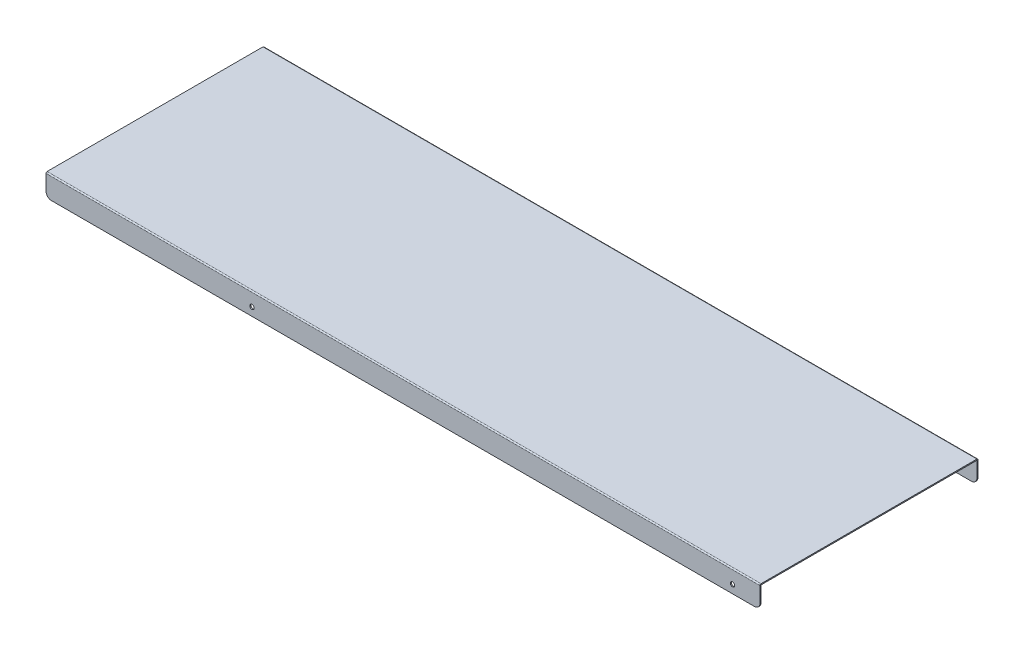
ISO-10303-21;
HEADER;
FILE_DESCRIPTION(('STEP AP214'),'2;1');
FILE_NAME('part.step','',(''),(''),'','','');
FILE_SCHEMA(('AUTOMOTIVE_DESIGN { 1 0 10303 214 1 1 1 1 }'));
ENDSEC;
DATA;
#1=APPLICATION_CONTEXT('core data for automotive mechanical design processes');
#2=APPLICATION_PROTOCOL_DEFINITION('international standard','automotive_design',2000,#1);
#3=PRODUCT_CONTEXT('',#1,'mechanical');
#4=PRODUCT('Part','Part','',(#3));
#5=PRODUCT_RELATED_PRODUCT_CATEGORY('part','',(#4));
#6=PRODUCT_DEFINITION_FORMATION('','',#4);
#7=PRODUCT_DEFINITION_CONTEXT('part definition',#1,'design');
#8=PRODUCT_DEFINITION('design','',#6,#7);
#9=PRODUCT_DEFINITION_SHAPE('','',#8);
#10=(LENGTH_UNIT() NAMED_UNIT(*) SI_UNIT(.MILLI.,.METRE.));
#11=(NAMED_UNIT(*) PLANE_ANGLE_UNIT() SI_UNIT($,.RADIAN.));
#12=(NAMED_UNIT(*) SI_UNIT($,.STERADIAN.) SOLID_ANGLE_UNIT());
#13=UNCERTAINTY_MEASURE_WITH_UNIT(LENGTH_MEASURE(1.E-05),#10,'distance_accuracy_value','');
#14=(GEOMETRIC_REPRESENTATION_CONTEXT(3) GLOBAL_UNCERTAINTY_ASSIGNED_CONTEXT((#13)) GLOBAL_UNIT_ASSIGNED_CONTEXT((#10,
#11,#12)) REPRESENTATION_CONTEXT('',''));
#15=CARTESIAN_POINT('',(0.,0.,0.));
#16=DIRECTION('',(0.,0.,1.));
#17=DIRECTION('',(1.,0.,0.));
#18=AXIS2_PLACEMENT_3D('',#15,#16,#17);
#19=CARTESIAN_POINT('',(600.,-25.0000000000002,-199.5));
#20=DIRECTION('',(0.,0.,1.));
#21=DIRECTION('',(1.,0.,0.));
#22=AXIS2_PLACEMENT_3D('',#19,#20,#21);
#23=CYLINDRICAL_SURFACE('',#22,3.99999999999999);
#24=CARTESIAN_POINT('',(600.,-25.0000000000002,197.5));
#25=DIRECTION('',(0.,0.,1.));
#26=DIRECTION('',(1.,0.,0.));
#27=AXIS2_PLACEMENT_3D('',#24,#25,#26);
#28=CIRCLE('',#27,3.99999999999999);
#29=CARTESIAN_POINT('',(604.,-25.0000000000002,197.5));
#30=VERTEX_POINT('',#29);
#31=EDGE_CURVE('E264',#30,#30,#28,.T.);
#32=ORIENTED_EDGE('',*,*,#31,.T.);
#33=EDGE_LOOP('',(#32));
#34=FACE_BOUND('',#33,.T.);
#35=CARTESIAN_POINT('',(600.,-25.0000000000002,195.5));
#36=DIRECTION('',(0.,0.,-1.));
#37=DIRECTION('',(-1.,0.,0.));
#38=AXIS2_PLACEMENT_3D('',#35,#36,#37);
#39=CIRCLE('',#38,3.99999999999999);
#40=CARTESIAN_POINT('',(596.,-25.0000000000002,195.5));
#41=VERTEX_POINT('',#40);
#42=EDGE_CURVE('E441',#41,#41,#39,.T.);
#43=ORIENTED_EDGE('',*,*,#42,.T.);
#44=EDGE_LOOP('',(#43));
#45=FACE_BOUND('',#44,.T.);
#46=ADVANCED_FACE('F53',(#34,#45),#23,.F.);
#47=CARTESIAN_POINT('',(-275.,-25.0000000000002,-199.5));
#48=DIRECTION('',(0.,0.,1.));
#49=DIRECTION('',(1.,0.,0.));
#50=AXIS2_PLACEMENT_3D('',#47,#48,#49);
#51=CYLINDRICAL_SURFACE('',#50,3.99999999999999);
#52=CARTESIAN_POINT('',(-275.,-25.0000000000002,197.5));
#53=DIRECTION('',(0.,0.,1.));
#54=DIRECTION('',(1.,0.,0.));
#55=AXIS2_PLACEMENT_3D('',#52,#53,#54);
#56=CIRCLE('',#55,3.99999999999999);
#57=CARTESIAN_POINT('',(-271.,-25.0000000000002,197.5));
#58=VERTEX_POINT('',#57);
#59=EDGE_CURVE('E436',#58,#58,#56,.T.);
#60=ORIENTED_EDGE('',*,*,#59,.T.);
#61=EDGE_LOOP('',(#60));
#62=FACE_BOUND('',#61,.T.);
#63=CARTESIAN_POINT('',(-275.,-25.0000000000002,195.5));
#64=DIRECTION('',(0.,0.,-1.));
#65=DIRECTION('',(-1.,0.,0.));
#66=AXIS2_PLACEMENT_3D('',#63,#64,#65);
#67=CIRCLE('',#66,3.99999999999999);
#68=CARTESIAN_POINT('',(-279.,-25.0000000000002,195.5));
#69=VERTEX_POINT('',#68);
#70=EDGE_CURVE('E431',#69,#69,#67,.T.);
#71=ORIENTED_EDGE('',*,*,#70,.T.);
#72=EDGE_LOOP('',(#71));
#73=FACE_BOUND('',#72,.T.);
#74=ADVANCED_FACE('F496',(#62,#73),#51,.F.);
#75=CARTESIAN_POINT('',(650.,-40.,-2403.60469608588));
#76=DIRECTION('',(0.,1.,0.));
#77=DIRECTION('',(0.,0.,1.));
#78=AXIS2_PLACEMENT_3D('',#75,#76,#77);
#79=PLANE('',#78);
#80=DIRECTION('',(1.,0.,0.));
#81=VECTOR('',#80,1.);
#82=CARTESIAN_POINT('',(650.,-40.,197.5));
#83=LINE('',#82,#81);
#84=CARTESIAN_POINT('',(-640.,-40.,197.5));
#85=VERTEX_POINT('',#84);
#86=CARTESIAN_POINT('',(640.,-40.,197.5));
#87=VERTEX_POINT('',#86);
#88=EDGE_CURVE('E419',#85,#87,#83,.T.);
#89=ORIENTED_EDGE('',*,*,#88,.F.);
#90=DIRECTION('',(0.,0.,1.));
#91=VECTOR('',#90,1.);
#92=CARTESIAN_POINT('',(-640.,-40.,-2403.60469608588));
#93=LINE('',#92,#91);
#94=CARTESIAN_POINT('',(-640.,-40.,195.5));
#95=VERTEX_POINT('',#94);
#96=EDGE_CURVE('E425',#95,#85,#93,.T.);
#97=ORIENTED_EDGE('',*,*,#96,.F.);
#98=DIRECTION('',(-1.,0.,0.));
#99=VECTOR('',#98,1.);
#100=CARTESIAN_POINT('',(650.,-40.,195.5));
#101=LINE('',#100,#99);
#102=CARTESIAN_POINT('',(640.,-40.,195.5));
#103=VERTEX_POINT('',#102);
#104=EDGE_CURVE('E66',#103,#95,#101,.T.);
#105=ORIENTED_EDGE('',*,*,#104,.F.);
#106=DIRECTION('',(0.,0.,1.));
#107=VECTOR('',#106,1.);
#108=CARTESIAN_POINT('',(640.,-40.,-2403.60469608588));
#109=LINE('',#108,#107);
#110=EDGE_CURVE('E429',#103,#87,#109,.T.);
#111=ORIENTED_EDGE('',*,*,#110,.T.);
#112=EDGE_LOOP('',(#89,#97,#105,#111));
#113=FACE_BOUND('',#112,.T.);
#114=ADVANCED_FACE('F502',(#113),#79,.F.);
#115=CARTESIAN_POINT('',(-640.,-30.,-2403.60469608588));
#116=DIRECTION('',(0.,0.,1.));
#117=DIRECTION('',(0.,-1.,0.));
#118=AXIS2_PLACEMENT_3D('',#115,#116,#117);
#119=CYLINDRICAL_SURFACE('',#118,10.);
#120=CARTESIAN_POINT('',(-640.,-30.,197.5));
#121=DIRECTION('',(0.,0.,1.));
#122=DIRECTION('',(1.,0.,0.));
#123=AXIS2_PLACEMENT_3D('',#120,#121,#122);
#124=CIRCLE('',#123,10.);
#125=CARTESIAN_POINT('',(-650.,-30.,197.5));
#126=VERTEX_POINT('',#125);
#127=EDGE_CURVE('E244',#126,#85,#124,.T.);
#128=ORIENTED_EDGE('',*,*,#127,.F.);
#129=DIRECTION('',(0.,0.,1.));
#130=VECTOR('',#129,1.);
#131=CARTESIAN_POINT('',(-650.,-30.,-2403.60469608588));
#132=LINE('',#131,#130);
#133=CARTESIAN_POINT('',(-650.,-30.,195.5));
#134=VERTEX_POINT('',#133);
#135=EDGE_CURVE('E253',#134,#126,#132,.T.);
#136=ORIENTED_EDGE('',*,*,#135,.F.);
#137=CARTESIAN_POINT('',(-640.,-30.,195.5));
#138=DIRECTION('',(0.,0.,1.));
#139=DIRECTION('',(1.,0.,0.));
#140=AXIS2_PLACEMENT_3D('',#137,#138,#139);
#141=CIRCLE('',#140,10.);
#142=EDGE_CURVE('E12',#95,#134,#141,.F.);
#143=ORIENTED_EDGE('',*,*,#142,.F.);
#144=ORIENTED_EDGE('',*,*,#96,.T.);
#145=EDGE_LOOP('',(#128,#136,#143,#144));
#146=FACE_BOUND('',#145,.T.);
#147=ADVANCED_FACE('F513',(#146),#119,.T.);
#148=CARTESIAN_POINT('',(640.,-30.,-2403.60469608588));
#149=DIRECTION('',(0.,0.,1.));
#150=DIRECTION('',(0.,-1.,0.));
#151=AXIS2_PLACEMENT_3D('',#148,#149,#150);
#152=CYLINDRICAL_SURFACE('',#151,10.);
#153=CARTESIAN_POINT('',(640.,-30.,197.5));
#154=DIRECTION('',(0.,0.,-1.));
#155=DIRECTION('',(-1.,0.,0.));
#156=AXIS2_PLACEMENT_3D('',#153,#154,#155);
#157=CIRCLE('',#156,10.);
#158=CARTESIAN_POINT('',(650.,-30.,197.5));
#159=VERTEX_POINT('',#158);
#160=EDGE_CURVE('E251',#87,#159,#157,.F.);
#161=ORIENTED_EDGE('',*,*,#160,.F.);
#162=ORIENTED_EDGE('',*,*,#110,.F.);
#163=CARTESIAN_POINT('',(640.,-30.,195.5));
#164=DIRECTION('',(0.,0.,-1.));
#165=DIRECTION('',(-1.,0.,0.));
#166=AXIS2_PLACEMENT_3D('',#163,#164,#165);
#167=CIRCLE('',#166,10.);
#168=CARTESIAN_POINT('',(650.,-30.,195.5));
#169=VERTEX_POINT('',#168);
#170=EDGE_CURVE('E393',#169,#103,#167,.T.);
#171=ORIENTED_EDGE('',*,*,#170,.F.);
#172=DIRECTION('',(0.,0.,1.));
#173=VECTOR('',#172,1.);
#174=CARTESIAN_POINT('',(650.,-30.,-2403.60469608588));
#175=LINE('',#174,#173);
#176=EDGE_CURVE('E245',#169,#159,#175,.T.);
#177=ORIENTED_EDGE('',*,*,#176,.T.);
#178=EDGE_LOOP('',(#161,#162,#171,#177));
#179=FACE_BOUND('',#178,.T.);
#180=ADVANCED_FACE('F517',(#179),#152,.T.);
#181=CARTESIAN_POINT('',(650.,0.,-2403.60469608588));
#182=DIRECTION('',(-1.,0.,0.));
#183=DIRECTION('',(0.,-1.,0.));
#184=AXIS2_PLACEMENT_3D('',#181,#182,#183);
#185=PLANE('',#184);
#186=DIRECTION('',(0.,1.,0.));
#187=VECTOR('',#186,1.);
#188=CARTESIAN_POINT('',(650.,0.,197.5));
#189=LINE('',#188,#187);
#190=CARTESIAN_POINT('',(650.,-2.09999999999941,197.5));
#191=VERTEX_POINT('',#190);
#192=EDGE_CURVE('E237',#159,#191,#189,.T.);
#193=ORIENTED_EDGE('',*,*,#192,.F.);
#194=ORIENTED_EDGE('',*,*,#176,.F.);
#195=DIRECTION('',(0.,1.,0.));
#196=VECTOR('',#195,1.);
#197=CARTESIAN_POINT('',(650.,0.,195.5));
#198=LINE('',#197,#196);
#199=CARTESIAN_POINT('',(650.,-2.09999999999985,195.5));
#200=VERTEX_POINT('',#199);
#201=EDGE_CURVE('E239',#200,#169,#198,.F.);
#202=ORIENTED_EDGE('',*,*,#201,.F.);
#203=DIRECTION('',(0.,0.,1.));
#204=VECTOR('',#203,1.);
#205=CARTESIAN_POINT('',(650.,-2.10000000000002,-2403.60469608588));
#206=LINE('',#205,#204);
#207=EDGE_CURVE('E234',#200,#191,#206,.T.);
#208=ORIENTED_EDGE('',*,*,#207,.T.);
#209=EDGE_LOOP('',(#193,#194,#202,#208));
#210=FACE_BOUND('',#209,.T.);
#211=ADVANCED_FACE('F235',(#210),#185,.F.);
#212=CARTESIAN_POINT('',(650.,-40.,197.5));
#213=DIRECTION('',(0.,0.,1.));
#214=DIRECTION('',(1.,0.,0.));
#215=AXIS2_PLACEMENT_3D('',#212,#213,#214);
#216=PLANE('',#215);
#217=DIRECTION('',(1.,0.,0.));
#218=VECTOR('',#217,1.);
#219=CARTESIAN_POINT('',(650.,-2.10000000000002,197.5));
#220=LINE('',#219,#218);
#221=CARTESIAN_POINT('',(-650.,-2.10000000000002,197.5));
#222=VERTEX_POINT('',#221);
#223=EDGE_CURVE('E122',#222,#191,#220,.T.);
#224=ORIENTED_EDGE('',*,*,#223,.F.);
#225=DIRECTION('',(0.,1.,0.));
#226=VECTOR('',#225,1.);
#227=CARTESIAN_POINT('',(-650.,0.,197.5));
#228=LINE('',#227,#226);
#229=EDGE_CURVE('E113',#126,#222,#228,.T.);
#230=ORIENTED_EDGE('',*,*,#229,.F.);
#231=ORIENTED_EDGE('',*,*,#127,.T.);
#232=ORIENTED_EDGE('',*,*,#88,.T.);
#233=ORIENTED_EDGE('',*,*,#160,.T.);
#234=ORIENTED_EDGE('',*,*,#192,.T.);
#235=EDGE_LOOP('',(#224,#230,#231,#232,#233,#234));
#236=FACE_BOUND('',#235,.T.);
#237=ORIENTED_EDGE('',*,*,#59,.F.);
#238=EDGE_LOOP('',(#237));
#239=FACE_BOUND('',#238,.T.);
#240=ORIENTED_EDGE('',*,*,#31,.F.);
#241=EDGE_LOOP('',(#240));
#242=FACE_BOUND('',#241,.T.);
#243=ADVANCED_FACE('F248',(#236,#239,#242),#216,.T.);
#244=CARTESIAN_POINT('',(-650.,0.,-2403.60469608588));
#245=DIRECTION('',(-1.,0.,0.));
#246=DIRECTION('',(0.,-1.,0.));
#247=AXIS2_PLACEMENT_3D('',#244,#245,#246);
#248=PLANE('',#247);
#249=ORIENTED_EDGE('',*,*,#135,.T.);
#250=ORIENTED_EDGE('',*,*,#229,.T.);
#251=DIRECTION('',(0.,0.,1.));
#252=VECTOR('',#251,1.);
#253=CARTESIAN_POINT('',(-650.,-2.10000000000002,-2403.60469608588));
#254=LINE('',#253,#252);
#255=CARTESIAN_POINT('',(-650.,-2.09999999999999,195.5));
#256=VERTEX_POINT('',#255);
#257=EDGE_CURVE('E265',#256,#222,#254,.T.);
#258=ORIENTED_EDGE('',*,*,#257,.F.);
#259=DIRECTION('',(0.,-1.,0.));
#260=VECTOR('',#259,1.);
#261=CARTESIAN_POINT('',(-650.,0.,195.5));
#262=LINE('',#261,#260);
#263=EDGE_CURVE('E404',#256,#134,#262,.T.);
#264=ORIENTED_EDGE('',*,*,#263,.T.);
#265=EDGE_LOOP('',(#249,#250,#258,#264));
#266=FACE_BOUND('',#265,.T.);
#267=ADVANCED_FACE('F527',(#266),#248,.T.);
#268=CARTESIAN_POINT('',(650.,-1.99999999999997,195.5));
#269=DIRECTION('',(0.,0.,-1.));
#270=DIRECTION('',(-1.,0.,0.));
#271=AXIS2_PLACEMENT_3D('',#268,#269,#270);
#272=PLANE('',#271);
#273=DIRECTION('',(-1.,0.,0.));
#274=VECTOR('',#273,1.);
#275=CARTESIAN_POINT('',(650.,-2.10000000000002,195.5));
#276=LINE('',#275,#274);
#277=EDGE_CURVE('E58',#200,#256,#276,.T.);
#278=ORIENTED_EDGE('',*,*,#277,.F.);
#279=ORIENTED_EDGE('',*,*,#201,.T.);
#280=ORIENTED_EDGE('',*,*,#170,.T.);
#281=ORIENTED_EDGE('',*,*,#104,.T.);
#282=ORIENTED_EDGE('',*,*,#142,.T.);
#283=ORIENTED_EDGE('',*,*,#263,.F.);
#284=EDGE_LOOP('',(#278,#279,#280,#281,#282,#283));
#285=FACE_BOUND('',#284,.T.);
#286=ORIENTED_EDGE('',*,*,#70,.F.);
#287=EDGE_LOOP('',(#286));
#288=FACE_BOUND('',#287,.T.);
#289=ORIENTED_EDGE('',*,*,#42,.F.);
#290=EDGE_LOOP('',(#289));
#291=FACE_BOUND('',#290,.T.);
#292=ADVANCED_FACE('F56',(#285,#288,#291),#272,.T.);
#293=CARTESIAN_POINT('',(600.,-25.0000000000002,-199.5));
#294=DIRECTION('',(0.,0.,1.));
#295=DIRECTION('',(1.,0.,0.));
#296=AXIS2_PLACEMENT_3D('',#293,#294,#295);
#297=CYLINDRICAL_SURFACE('',#296,3.99999999999999);
#298=CARTESIAN_POINT('',(600.,-25.0000000000002,-197.5));
#299=DIRECTION('',(0.,0.,1.));
#300=DIRECTION('',(1.,0.,0.));
#301=AXIS2_PLACEMENT_3D('',#298,#299,#300);
#302=CIRCLE('',#301,3.99999999999999);
#303=CARTESIAN_POINT('',(604.,-25.0000000000002,-197.5));
#304=VERTEX_POINT('',#303);
#305=EDGE_CURVE('E375',#304,#304,#302,.T.);
#306=ORIENTED_EDGE('',*,*,#305,.T.);
#307=EDGE_LOOP('',(#306));
#308=FACE_BOUND('',#307,.T.);
#309=CARTESIAN_POINT('',(600.,-25.0000000000002,-199.5));
#310=DIRECTION('',(0.,0.,1.));
#311=DIRECTION('',(1.,0.,0.));
#312=AXIS2_PLACEMENT_3D('',#309,#310,#311);
#313=CIRCLE('',#312,3.99999999999999);
#314=CARTESIAN_POINT('',(604.,-25.0000000000002,-199.5));
#315=VERTEX_POINT('',#314);
#316=EDGE_CURVE('E595',#315,#315,#313,.T.);
#317=ORIENTED_EDGE('',*,*,#316,.F.);
#318=EDGE_LOOP('',(#317));
#319=FACE_BOUND('',#318,.T.);
#320=ADVANCED_FACE('F533',(#308,#319),#297,.F.);
#321=CARTESIAN_POINT('',(-275.,-25.0000000000002,-199.5));
#322=DIRECTION('',(0.,0.,1.));
#323=DIRECTION('',(1.,0.,0.));
#324=AXIS2_PLACEMENT_3D('',#321,#322,#323);
#325=CYLINDRICAL_SURFACE('',#324,3.99999999999999);
#326=CARTESIAN_POINT('',(-275.,-25.0000000000002,-197.5));
#327=DIRECTION('',(0.,0.,1.));
#328=DIRECTION('',(1.,0.,0.));
#329=AXIS2_PLACEMENT_3D('',#326,#327,#328);
#330=CIRCLE('',#329,3.99999999999999);
#331=CARTESIAN_POINT('',(-271.,-25.0000000000002,-197.5));
#332=VERTEX_POINT('',#331);
#333=EDGE_CURVE('E369',#332,#332,#330,.T.);
#334=ORIENTED_EDGE('',*,*,#333,.T.);
#335=EDGE_LOOP('',(#334));
#336=FACE_BOUND('',#335,.T.);
#337=CARTESIAN_POINT('',(-275.,-25.0000000000002,-199.5));
#338=DIRECTION('',(0.,0.,1.));
#339=DIRECTION('',(1.,0.,0.));
#340=AXIS2_PLACEMENT_3D('',#337,#338,#339);
#341=CIRCLE('',#340,3.99999999999999);
#342=CARTESIAN_POINT('',(-271.,-25.0000000000002,-199.5));
#343=VERTEX_POINT('',#342);
#344=EDGE_CURVE('E585',#343,#343,#341,.T.);
#345=ORIENTED_EDGE('',*,*,#344,.F.);
#346=EDGE_LOOP('',(#345));
#347=FACE_BOUND('',#346,.T.);
#348=ADVANCED_FACE('F639',(#336,#347),#325,.F.);
#349=CARTESIAN_POINT('',(650.,-40.,2401.60469608588));
#350=DIRECTION('',(0.,1.,0.));
#351=DIRECTION('',(0.,0.,1.));
#352=AXIS2_PLACEMENT_3D('',#349,#350,#351);
#353=PLANE('',#352);
#354=DIRECTION('',(-1.,0.,0.));
#355=VECTOR('',#354,1.);
#356=CARTESIAN_POINT('',(650.,-40.,-199.5));
#357=LINE('',#356,#355);
#358=CARTESIAN_POINT('',(640.,-40.,-199.5));
#359=VERTEX_POINT('',#358);
#360=CARTESIAN_POINT('',(-640.,-40.,-199.5));
#361=VERTEX_POINT('',#360);
#362=EDGE_CURVE('E180',#359,#361,#357,.T.);
#363=ORIENTED_EDGE('',*,*,#362,.F.);
#364=DIRECTION('',(0.,0.,-1.));
#365=VECTOR('',#364,1.);
#366=CARTESIAN_POINT('',(640.,-40.,2401.60469608588));
#367=LINE('',#366,#365);
#368=CARTESIAN_POINT('',(640.,-40.,-197.5));
#369=VERTEX_POINT('',#368);
#370=EDGE_CURVE('E566',#369,#359,#367,.T.);
#371=ORIENTED_EDGE('',*,*,#370,.F.);
#372=DIRECTION('',(1.,0.,0.));
#373=VECTOR('',#372,1.);
#374=CARTESIAN_POINT('',(650.,-40.,-197.5));
#375=LINE('',#374,#373);
#376=CARTESIAN_POINT('',(-640.,-40.,-197.5));
#377=VERTEX_POINT('',#376);
#378=EDGE_CURVE('E174',#377,#369,#375,.T.);
#379=ORIENTED_EDGE('',*,*,#378,.F.);
#380=DIRECTION('',(0.,0.,-1.));
#381=VECTOR('',#380,1.);
#382=CARTESIAN_POINT('',(-640.,-40.,2401.60469608588));
#383=LINE('',#382,#381);
#384=EDGE_CURVE('E374',#377,#361,#383,.T.);
#385=ORIENTED_EDGE('',*,*,#384,.T.);
#386=EDGE_LOOP('',(#363,#371,#379,#385));
#387=FACE_BOUND('',#386,.T.);
#388=ADVANCED_FACE('F573',(#387),#353,.F.);
#389=CARTESIAN_POINT('',(640.,-30.,2401.60469608588));
#390=DIRECTION('',(0.,0.,-1.));
#391=DIRECTION('',(0.,1.,0.));
#392=AXIS2_PLACEMENT_3D('',#389,#390,#391);
#393=CYLINDRICAL_SURFACE('',#392,10.);
#394=CARTESIAN_POINT('',(640.,-30.,-199.5));
#395=DIRECTION('',(0.,0.,-1.));
#396=DIRECTION('',(-1.,0.,0.));
#397=AXIS2_PLACEMENT_3D('',#394,#395,#396);
#398=CIRCLE('',#397,10.);
#399=CARTESIAN_POINT('',(650.,-30.,-199.5));
#400=VERTEX_POINT('',#399);
#401=EDGE_CURVE('E569',#359,#400,#398,.F.);
#402=ORIENTED_EDGE('',*,*,#401,.T.);
#403=DIRECTION('',(0.,0.,-1.));
#404=VECTOR('',#403,1.);
#405=CARTESIAN_POINT('',(650.,-30.,2401.60469608588));
#406=LINE('',#405,#404);
#407=CARTESIAN_POINT('',(650.,-30.,-197.5));
#408=VERTEX_POINT('',#407);
#409=EDGE_CURVE('E600',#408,#400,#406,.T.);
#410=ORIENTED_EDGE('',*,*,#409,.F.);
#411=CARTESIAN_POINT('',(640.,-30.,-197.5));
#412=DIRECTION('',(0.,0.,-1.));
#413=DIRECTION('',(-1.,0.,0.));
#414=AXIS2_PLACEMENT_3D('',#411,#412,#413);
#415=CIRCLE('',#414,10.);
#416=EDGE_CURVE('E361',#369,#408,#415,.F.);
#417=ORIENTED_EDGE('',*,*,#416,.F.);
#418=ORIENTED_EDGE('',*,*,#370,.T.);
#419=EDGE_LOOP('',(#402,#410,#417,#418));
#420=FACE_BOUND('',#419,.T.);
#421=ADVANCED_FACE('F616',(#420),#393,.T.);
#422=CARTESIAN_POINT('',(-640.,-30.,2401.60469608588));
#423=DIRECTION('',(0.,0.,-1.));
#424=DIRECTION('',(0.,1.,0.));
#425=AXIS2_PLACEMENT_3D('',#422,#423,#424);
#426=CYLINDRICAL_SURFACE('',#425,10.);
#427=CARTESIAN_POINT('',(-640.,-30.,-199.5));
#428=DIRECTION('',(0.,0.,1.));
#429=DIRECTION('',(1.,0.,0.));
#430=AXIS2_PLACEMENT_3D('',#427,#428,#429);
#431=CIRCLE('',#430,10.);
#432=CARTESIAN_POINT('',(-650.,-30.,-199.5));
#433=VERTEX_POINT('',#432);
#434=EDGE_CURVE('E583',#361,#433,#431,.F.);
#435=ORIENTED_EDGE('',*,*,#434,.F.);
#436=ORIENTED_EDGE('',*,*,#384,.F.);
#437=CARTESIAN_POINT('',(-640.,-30.,-197.5));
#438=DIRECTION('',(0.,0.,1.));
#439=DIRECTION('',(1.,0.,0.));
#440=AXIS2_PLACEMENT_3D('',#437,#438,#439);
#441=CIRCLE('',#440,10.);
#442=CARTESIAN_POINT('',(-650.,-30.,-197.5));
#443=VERTEX_POINT('',#442);
#444=EDGE_CURVE('E607',#443,#377,#441,.T.);
#445=ORIENTED_EDGE('',*,*,#444,.F.);
#446=DIRECTION('',(0.,0.,-1.));
#447=VECTOR('',#446,1.);
#448=CARTESIAN_POINT('',(-650.,-30.,2401.60469608588));
#449=LINE('',#448,#447);
#450=EDGE_CURVE('E562',#443,#433,#449,.T.);
#451=ORIENTED_EDGE('',*,*,#450,.T.);
#452=EDGE_LOOP('',(#435,#436,#445,#451));
#453=FACE_BOUND('',#452,.T.);
#454=ADVANCED_FACE('F648',(#453),#426,.T.);
#455=CARTESIAN_POINT('',(-650.,-40.,2401.60469608588));
#456=DIRECTION('',(1.,0.,0.));
#457=DIRECTION('',(0.,-1.,0.));
#458=AXIS2_PLACEMENT_3D('',#455,#456,#457);
#459=PLANE('',#458);
#460=DIRECTION('',(0.,1.,0.));
#461=VECTOR('',#460,1.);
#462=CARTESIAN_POINT('',(-650.,0.,-199.5));
#463=LINE('',#462,#461);
#464=CARTESIAN_POINT('',(-650.,-2.10000000000015,-199.5));
#465=VERTEX_POINT('',#464);
#466=EDGE_CURVE('E559',#465,#433,#463,.F.);
#467=ORIENTED_EDGE('',*,*,#466,.T.);
#468=ORIENTED_EDGE('',*,*,#450,.F.);
#469=DIRECTION('',(0.,1.,0.));
#470=VECTOR('',#469,1.);
#471=CARTESIAN_POINT('',(-650.,-40.,-197.5));
#472=LINE('',#471,#470);
#473=CARTESIAN_POINT('',(-650.,-2.10000000000002,-197.5));
#474=VERTEX_POINT('',#473);
#475=EDGE_CURVE('E603',#474,#443,#472,.F.);
#476=ORIENTED_EDGE('',*,*,#475,.F.);
#477=DIRECTION('',(0.,0.,-1.));
#478=VECTOR('',#477,1.);
#479=CARTESIAN_POINT('',(-650.,-2.10000000000002,2401.60469608588));
#480=LINE('',#479,#478);
#481=EDGE_CURVE('E553',#474,#465,#480,.T.);
#482=ORIENTED_EDGE('',*,*,#481,.T.);
#483=EDGE_LOOP('',(#467,#468,#476,#482));
#484=FACE_BOUND('',#483,.T.);
#485=ADVANCED_FACE('F651',(#484),#459,.F.);
#486=CARTESIAN_POINT('',(650.,0.,-199.5));
#487=DIRECTION('',(0.,0.,-1.));
#488=DIRECTION('',(-1.,0.,0.));
#489=AXIS2_PLACEMENT_3D('',#486,#487,#488);
#490=PLANE('',#489);
#491=DIRECTION('',(-1.,0.,0.));
#492=VECTOR('',#491,1.);
#493=CARTESIAN_POINT('',(-650.,-2.10000000000002,-199.5));
#494=LINE('',#493,#492);
#495=CARTESIAN_POINT('',(650.,-2.10000000000002,-199.5));
#496=VERTEX_POINT('',#495);
#497=EDGE_CURVE('E380',#496,#465,#494,.T.);
#498=ORIENTED_EDGE('',*,*,#497,.F.);
#499=DIRECTION('',(0.,-1.,0.));
#500=VECTOR('',#499,1.);
#501=CARTESIAN_POINT('',(650.,0.,-199.5));
#502=LINE('',#501,#500);
#503=EDGE_CURVE('E550',#496,#400,#502,.T.);
#504=ORIENTED_EDGE('',*,*,#503,.T.);
#505=ORIENTED_EDGE('',*,*,#401,.F.);
#506=ORIENTED_EDGE('',*,*,#362,.T.);
#507=ORIENTED_EDGE('',*,*,#434,.T.);
#508=ORIENTED_EDGE('',*,*,#466,.F.);
#509=EDGE_LOOP('',(#498,#504,#505,#506,#507,#508));
#510=FACE_BOUND('',#509,.T.);
#511=ORIENTED_EDGE('',*,*,#344,.T.);
#512=EDGE_LOOP('',(#511));
#513=FACE_BOUND('',#512,.T.);
#514=ORIENTED_EDGE('',*,*,#316,.T.);
#515=EDGE_LOOP('',(#514));
#516=FACE_BOUND('',#515,.T.);
#517=ADVANCED_FACE('F581',(#510,#513,#516),#490,.T.);
#518=CARTESIAN_POINT('',(650.,0.,2401.60469608588));
#519=DIRECTION('',(-1.,0.,0.));
#520=DIRECTION('',(0.,1.,0.));
#521=AXIS2_PLACEMENT_3D('',#518,#519,#520);
#522=PLANE('',#521);
#523=ORIENTED_EDGE('',*,*,#503,.F.);
#524=DIRECTION('',(0.,0.,-1.));
#525=VECTOR('',#524,1.);
#526=CARTESIAN_POINT('',(650.,-2.10000000000002,2401.60469608588));
#527=LINE('',#526,#525);
#528=CARTESIAN_POINT('',(650.,-2.09999999999999,-197.5));
#529=VERTEX_POINT('',#528);
#530=EDGE_CURVE('E384',#529,#496,#527,.T.);
#531=ORIENTED_EDGE('',*,*,#530,.F.);
#532=DIRECTION('',(0.,1.,0.));
#533=VECTOR('',#532,1.);
#534=CARTESIAN_POINT('',(650.,0.,-197.5));
#535=LINE('',#534,#533);
#536=EDGE_CURVE('E133',#408,#529,#535,.T.);
#537=ORIENTED_EDGE('',*,*,#536,.F.);
#538=ORIENTED_EDGE('',*,*,#409,.T.);
#539=EDGE_LOOP('',(#523,#531,#537,#538));
#540=FACE_BOUND('',#539,.T.);
#541=ADVANCED_FACE('F618',(#540),#522,.F.);
#542=CARTESIAN_POINT('',(650.,-40.,-197.5));
#543=DIRECTION('',(0.,0.,1.));
#544=DIRECTION('',(1.,0.,0.));
#545=AXIS2_PLACEMENT_3D('',#542,#543,#544);
#546=PLANE('',#545);
#547=DIRECTION('',(1.,0.,0.));
#548=VECTOR('',#547,1.);
#549=CARTESIAN_POINT('',(-650.,-2.10000000000002,-197.5));
#550=LINE('',#549,#548);
#551=EDGE_CURVE('E354',#474,#529,#550,.T.);
#552=ORIENTED_EDGE('',*,*,#551,.F.);
#553=ORIENTED_EDGE('',*,*,#475,.T.);
#554=ORIENTED_EDGE('',*,*,#444,.T.);
#555=ORIENTED_EDGE('',*,*,#378,.T.);
#556=ORIENTED_EDGE('',*,*,#416,.T.);
#557=ORIENTED_EDGE('',*,*,#536,.T.);
#558=EDGE_LOOP('',(#552,#553,#554,#555,#556,#557));
#559=FACE_BOUND('',#558,.T.);
#560=ORIENTED_EDGE('',*,*,#333,.F.);
#561=EDGE_LOOP('',(#560));
#562=FACE_BOUND('',#561,.T.);
#563=ORIENTED_EDGE('',*,*,#305,.F.);
#564=EDGE_LOOP('',(#563));
#565=FACE_BOUND('',#564,.T.);
#566=ADVANCED_FACE('F508',(#559,#562,#565),#546,.T.);
#567=CARTESIAN_POINT('',(650.,-2716.09413680749,-197.5));
#568=DIRECTION('',(-1.,0.,0.));
#569=DIRECTION('',(0.,0.,1.));
#570=AXIS2_PLACEMENT_3D('',#567,#568,#569);
#571=PLANE('',#570);
#572=DIRECTION('',(0.,0.,1.));
#573=VECTOR('',#572,1.);
#574=CARTESIAN_POINT('',(650.,0.,0.));
#575=LINE('',#574,#573);
#576=CARTESIAN_POINT('',(650.,0.,195.4));
#577=VERTEX_POINT('',#576);
#578=CARTESIAN_POINT('',(650.,0.,-197.4));
#579=VERTEX_POINT('',#578);
#580=EDGE_CURVE('E291',#577,#579,#575,.F.);
#581=ORIENTED_EDGE('',*,*,#580,.F.);
#582=DIRECTION('',(0.,1.,0.));
#583=VECTOR('',#582,1.);
#584=CARTESIAN_POINT('',(650.,-2716.09413680749,195.4));
#585=LINE('',#584,#583);
#586=CARTESIAN_POINT('',(650.,-2.,195.4));
#587=VERTEX_POINT('',#586);
#588=EDGE_CURVE('E269',#587,#577,#585,.T.);
#589=ORIENTED_EDGE('',*,*,#588,.F.);
#590=DIRECTION('',(0.,0.,-1.));
#591=VECTOR('',#590,1.);
#592=CARTESIAN_POINT('',(650.,-2.,-197.5));
#593=LINE('',#592,#591);
#594=CARTESIAN_POINT('',(650.,-2.,-197.4));
#595=VERTEX_POINT('',#594);
#596=EDGE_CURVE('E290',#595,#587,#593,.F.);
#597=ORIENTED_EDGE('',*,*,#596,.F.);
#598=DIRECTION('',(0.,1.,0.));
#599=VECTOR('',#598,1.);
#600=CARTESIAN_POINT('',(650.,-2716.09413680749,-197.4));
#601=LINE('',#600,#599);
#602=EDGE_CURVE('E305',#595,#579,#601,.T.);
#603=ORIENTED_EDGE('',*,*,#602,.T.);
#604=EDGE_LOOP('',(#581,#589,#597,#603));
#605=FACE_BOUND('',#604,.T.);
#606=ADVANCED_FACE('F471',(#605),#571,.F.);
#607=CARTESIAN_POINT('',(-650.,-2716.09413680749,-197.5));
#608=DIRECTION('',(1.,0.,0.));
#609=DIRECTION('',(0.,0.,-1.));
#610=AXIS2_PLACEMENT_3D('',#607,#608,#609);
#611=PLANE('',#610);
#612=DIRECTION('',(0.,0.,1.));
#613=VECTOR('',#612,1.);
#614=CARTESIAN_POINT('',(-650.,0.,0.));
#615=LINE('',#614,#613);
#616=CARTESIAN_POINT('',(-650.,0.,195.4));
#617=VERTEX_POINT('',#616);
#618=CARTESIAN_POINT('',(-650.,0.,-197.4));
#619=VERTEX_POINT('',#618);
#620=EDGE_CURVE('E323',#617,#619,#615,.F.);
#621=ORIENTED_EDGE('',*,*,#620,.T.);
#622=DIRECTION('',(0.,1.,0.));
#623=VECTOR('',#622,1.);
#624=CARTESIAN_POINT('',(-650.,-2716.09413680749,-197.4));
#625=LINE('',#624,#623);
#626=CARTESIAN_POINT('',(-650.,-2.00000000000002,-197.4));
#627=VERTEX_POINT('',#626);
#628=EDGE_CURVE('E462',#627,#619,#625,.T.);
#629=ORIENTED_EDGE('',*,*,#628,.F.);
#630=DIRECTION('',(0.,0.,-1.));
#631=VECTOR('',#630,1.);
#632=CARTESIAN_POINT('',(-650.,-2.,-197.5));
#633=LINE('',#632,#631);
#634=CARTESIAN_POINT('',(-650.,-1.99999999999978,195.4));
#635=VERTEX_POINT('',#634);
#636=EDGE_CURVE('E295',#635,#627,#633,.T.);
#637=ORIENTED_EDGE('',*,*,#636,.F.);
#638=DIRECTION('',(0.,1.,0.));
#639=VECTOR('',#638,1.);
#640=CARTESIAN_POINT('',(-650.,-2716.09413680749,195.4));
#641=LINE('',#640,#639);
#642=EDGE_CURVE('E459',#635,#617,#641,.T.);
#643=ORIENTED_EDGE('',*,*,#642,.T.);
#644=EDGE_LOOP('',(#621,#629,#637,#643));
#645=FACE_BOUND('',#644,.T.);
#646=ADVANCED_FACE('F464',(#645),#611,.F.);
#647=CARTESIAN_POINT('',(650.,-2.,-197.5));
#648=DIRECTION('',(0.,-1.,0.));
#649=DIRECTION('',(0.,0.,-1.));
#650=AXIS2_PLACEMENT_3D('',#647,#648,#649);
#651=PLANE('',#650);
#652=ORIENTED_EDGE('',*,*,#596,.T.);
#653=DIRECTION('',(-1.,0.,0.));
#654=VECTOR('',#653,1.);
#655=CARTESIAN_POINT('',(650.,-1.99999999999978,195.4));
#656=LINE('',#655,#654);
#657=EDGE_CURVE('E300',#587,#635,#656,.T.);
#658=ORIENTED_EDGE('',*,*,#657,.T.);
#659=ORIENTED_EDGE('',*,*,#636,.T.);
#660=DIRECTION('',(1.,0.,0.));
#661=VECTOR('',#660,1.);
#662=CARTESIAN_POINT('',(-650.,-1.99999999999978,-197.4));
#663=LINE('',#662,#661);
#664=EDGE_CURVE('E355',#627,#595,#663,.T.);
#665=ORIENTED_EDGE('',*,*,#664,.T.);
#666=EDGE_LOOP('',(#652,#658,#659,#665));
#667=FACE_BOUND('',#666,.T.);
#668=ADVANCED_FACE('F467',(#667),#651,.T.);
#669=CARTESIAN_POINT('',(650.,0.,199.5));
#670=DIRECTION('',(0.,1.,0.));
#671=DIRECTION('',(0.,0.,1.));
#672=AXIS2_PLACEMENT_3D('',#669,#670,#671);
#673=PLANE('',#672);
#674=ORIENTED_EDGE('',*,*,#620,.F.);
#675=DIRECTION('',(1.,0.,0.));
#676=VECTOR('',#675,1.);
#677=CARTESIAN_POINT('',(650.,0.,195.4));
#678=LINE('',#677,#676);
#679=EDGE_CURVE('E285',#617,#577,#678,.T.);
#680=ORIENTED_EDGE('',*,*,#679,.T.);
#681=ORIENTED_EDGE('',*,*,#580,.T.);
#682=DIRECTION('',(-1.,0.,0.));
#683=VECTOR('',#682,1.);
#684=CARTESIAN_POINT('',(-650.,0.,-197.4));
#685=LINE('',#684,#683);
#686=EDGE_CURVE('E349',#579,#619,#685,.T.);
#687=ORIENTED_EDGE('',*,*,#686,.T.);
#688=EDGE_LOOP('',(#674,#680,#681,#687));
#689=FACE_BOUND('',#688,.T.);
#690=ADVANCED_FACE('F480',(#689),#673,.T.);
#691=CARTESIAN_POINT('',(650.,-2.1,-197.4));
#692=DIRECTION('',(1.,0.,0.));
#693=DIRECTION('',(0.,1.,0.));
#694=AXIS2_PLACEMENT_3D('',#691,#692,#693);
#695=PLANE('',#694);
#696=ORIENTED_EDGE('',*,*,#602,.F.);
#697=CARTESIAN_POINT('',(650.,-2.1,-197.4));
#698=DIRECTION('',(1.,0.,0.));
#699=DIRECTION('',(0.,1.,0.));
#700=AXIS2_PLACEMENT_3D('',#697,#698,#699);
#701=CIRCLE('',#700,0.0999999999999778);
#702=EDGE_CURVE('E200',#595,#529,#701,.F.);
#703=ORIENTED_EDGE('',*,*,#702,.T.);
#704=ORIENTED_EDGE('',*,*,#530,.T.);
#705=CARTESIAN_POINT('',(650.,-2.1,-197.4));
#706=DIRECTION('',(1.,0.,0.));
#707=DIRECTION('',(0.,1.,0.));
#708=AXIS2_PLACEMENT_3D('',#705,#706,#707);
#709=CIRCLE('',#708,2.09999999999998);
#710=EDGE_CURVE('E319',#579,#496,#709,.F.);
#711=ORIENTED_EDGE('',*,*,#710,.F.);
#712=EDGE_LOOP('',(#696,#703,#704,#711));
#713=FACE_BOUND('',#712,.T.);
#714=ADVANCED_FACE('F491',(#713),#695,.T.);
#715=CARTESIAN_POINT('',(-650.,-2.1,-197.4));
#716=DIRECTION('',(-1.,0.,0.));
#717=DIRECTION('',(0.,-1.,0.));
#718=AXIS2_PLACEMENT_3D('',#715,#716,#717);
#719=PLANE('',#718);
#720=ORIENTED_EDGE('',*,*,#481,.F.);
#721=CARTESIAN_POINT('',(-650.,-2.1,-197.4));
#722=DIRECTION('',(1.,0.,0.));
#723=DIRECTION('',(0.,1.,0.));
#724=AXIS2_PLACEMENT_3D('',#721,#722,#723);
#725=CIRCLE('',#724,0.0999999999999778);
#726=EDGE_CURVE('E274',#474,#627,#725,.T.);
#727=ORIENTED_EDGE('',*,*,#726,.T.);
#728=ORIENTED_EDGE('',*,*,#628,.T.);
#729=CARTESIAN_POINT('',(-650.,-2.1,-197.4));
#730=DIRECTION('',(1.,0.,0.));
#731=DIRECTION('',(0.,1.,0.));
#732=AXIS2_PLACEMENT_3D('',#729,#730,#731);
#733=CIRCLE('',#732,2.09999999999998);
#734=EDGE_CURVE('E322',#465,#619,#733,.T.);
#735=ORIENTED_EDGE('',*,*,#734,.F.);
#736=EDGE_LOOP('',(#720,#727,#728,#735));
#737=FACE_BOUND('',#736,.T.);
#738=ADVANCED_FACE('F484',(#737),#719,.T.);
#739=CARTESIAN_POINT('',(-2032.42252585814,-2.1,-197.4));
#740=DIRECTION('',(1.,0.,0.));
#741=DIRECTION('',(0.,1.,0.));
#742=AXIS2_PLACEMENT_3D('',#739,#740,#741);
#743=CYLINDRICAL_SURFACE('',#742,2.09999999999998);
#744=ORIENTED_EDGE('',*,*,#734,.T.);
#745=ORIENTED_EDGE('',*,*,#686,.F.);
#746=ORIENTED_EDGE('',*,*,#710,.T.);
#747=ORIENTED_EDGE('',*,*,#497,.T.);
#748=EDGE_LOOP('',(#744,#745,#746,#747));
#749=FACE_BOUND('',#748,.T.);
#750=ADVANCED_FACE('F481',(#749),#743,.T.);
#751=CARTESIAN_POINT('',(-2032.42252585814,-2.1,-197.4));
#752=DIRECTION('',(1.,0.,0.));
#753=DIRECTION('',(0.,1.,0.));
#754=AXIS2_PLACEMENT_3D('',#751,#752,#753);
#755=CYLINDRICAL_SURFACE('',#754,0.0999999999999778);
#756=ORIENTED_EDGE('',*,*,#726,.F.);
#757=ORIENTED_EDGE('',*,*,#551,.T.);
#758=ORIENTED_EDGE('',*,*,#702,.F.);
#759=ORIENTED_EDGE('',*,*,#664,.F.);
#760=EDGE_LOOP('',(#756,#757,#758,#759));
#761=FACE_BOUND('',#760,.T.);
#762=ADVANCED_FACE('F483',(#761),#755,.F.);
#763=CARTESIAN_POINT('',(-650.,-2.1,195.4));
#764=DIRECTION('',(-1.,0.,0.));
#765=DIRECTION('',(0.,0.,1.));
#766=AXIS2_PLACEMENT_3D('',#763,#764,#765);
#767=PLANE('',#766);
#768=ORIENTED_EDGE('',*,*,#642,.F.);
#769=CARTESIAN_POINT('',(-650.,-2.1,195.4));
#770=DIRECTION('',(-1.,0.,0.));
#771=DIRECTION('',(0.,0.,1.));
#772=AXIS2_PLACEMENT_3D('',#769,#770,#771);
#773=CIRCLE('',#772,0.0999999999999995);
#774=EDGE_CURVE('E190',#635,#256,#773,.F.);
#775=ORIENTED_EDGE('',*,*,#774,.T.);
#776=ORIENTED_EDGE('',*,*,#257,.T.);
#777=CARTESIAN_POINT('',(-650.,-2.1,195.4));
#778=DIRECTION('',(-1.,0.,0.));
#779=DIRECTION('',(0.,0.,1.));
#780=AXIS2_PLACEMENT_3D('',#777,#778,#779);
#781=CIRCLE('',#780,2.1);
#782=EDGE_CURVE('E262',#617,#222,#781,.F.);
#783=ORIENTED_EDGE('',*,*,#782,.F.);
#784=EDGE_LOOP('',(#768,#775,#776,#783));
#785=FACE_BOUND('',#784,.T.);
#786=ADVANCED_FACE('F458',(#785),#767,.T.);
#787=CARTESIAN_POINT('',(650.,-2.1,195.4));
#788=DIRECTION('',(1.,0.,0.));
#789=DIRECTION('',(0.,0.,-1.));
#790=AXIS2_PLACEMENT_3D('',#787,#788,#789);
#791=PLANE('',#790);
#792=ORIENTED_EDGE('',*,*,#207,.F.);
#793=CARTESIAN_POINT('',(650.,-2.1,195.4));
#794=DIRECTION('',(-1.,0.,0.));
#795=DIRECTION('',(0.,0.,1.));
#796=AXIS2_PLACEMENT_3D('',#793,#794,#795);
#797=CIRCLE('',#796,0.0999999999999995);
#798=EDGE_CURVE('E276',#200,#587,#797,.T.);
#799=ORIENTED_EDGE('',*,*,#798,.T.);
#800=ORIENTED_EDGE('',*,*,#588,.T.);
#801=CARTESIAN_POINT('',(650.,-2.1,195.4));
#802=DIRECTION('',(-1.,0.,0.));
#803=DIRECTION('',(0.,0.,1.));
#804=AXIS2_PLACEMENT_3D('',#801,#802,#803);
#805=CIRCLE('',#804,2.1);
#806=EDGE_CURVE('E260',#191,#577,#805,.T.);
#807=ORIENTED_EDGE('',*,*,#806,.F.);
#808=EDGE_LOOP('',(#792,#799,#800,#807));
#809=FACE_BOUND('',#808,.T.);
#810=ADVANCED_FACE('F267',(#809),#791,.T.);
#811=CARTESIAN_POINT('',(2020.98831504867,-2.1,195.4));
#812=DIRECTION('',(-1.,0.,0.));
#813=DIRECTION('',(0.,0.,1.));
#814=AXIS2_PLACEMENT_3D('',#811,#812,#813);
#815=CYLINDRICAL_SURFACE('',#814,2.1);
#816=ORIENTED_EDGE('',*,*,#806,.T.);
#817=ORIENTED_EDGE('',*,*,#679,.F.);
#818=ORIENTED_EDGE('',*,*,#782,.T.);
#819=ORIENTED_EDGE('',*,*,#223,.T.);
#820=EDGE_LOOP('',(#816,#817,#818,#819));
#821=FACE_BOUND('',#820,.T.);
#822=ADVANCED_FACE('F258',(#821),#815,.T.);
#823=CARTESIAN_POINT('',(2020.98831504867,-2.1,195.4));
#824=DIRECTION('',(-1.,0.,0.));
#825=DIRECTION('',(0.,0.,1.));
#826=AXIS2_PLACEMENT_3D('',#823,#824,#825);
#827=CYLINDRICAL_SURFACE('',#826,0.0999999999999995);
#828=ORIENTED_EDGE('',*,*,#798,.F.);
#829=ORIENTED_EDGE('',*,*,#277,.T.);
#830=ORIENTED_EDGE('',*,*,#774,.F.);
#831=ORIENTED_EDGE('',*,*,#657,.F.);
#832=EDGE_LOOP('',(#828,#829,#830,#831));
#833=FACE_BOUND('',#832,.T.);
#834=ADVANCED_FACE('F457',(#833),#827,.F.);
#835=CLOSED_SHELL('',(#46,#74,#114,#147,#180,#211,#243,#267,#292,#320,#348,#388,#421,#454,#485,
#517,#541,#566,#606,#646,#668,#690,#714,#738,#750,#762,#786,#810,#822,#834));
#836=MANIFOLD_SOLID_BREP('B2',#835);
#837=ADVANCED_BREP_SHAPE_REPRESENTATION('',(#18,#836),#14);
#838=SHAPE_DEFINITION_REPRESENTATION(#9,#837);
ENDSEC;
END-ISO-10303-21;
